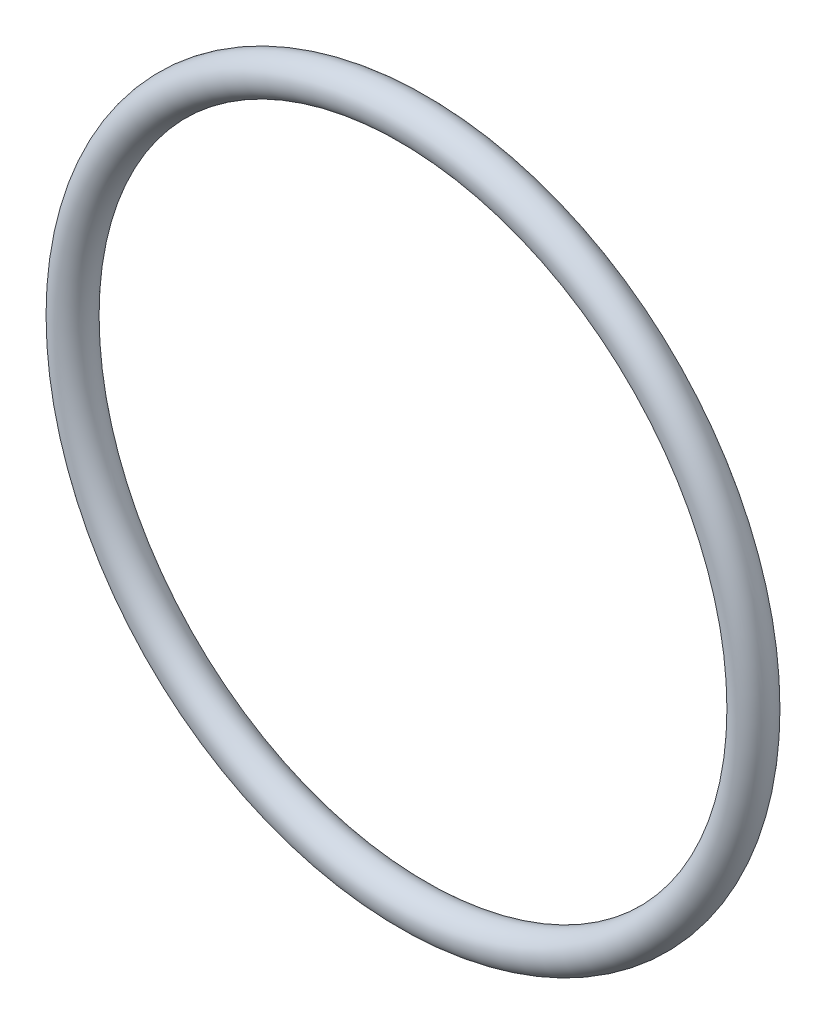
ISO-10303-21;
HEADER;
FILE_DESCRIPTION(('STEP AP214'),'2;1');
FILE_NAME('part.step','',(''),(''),'','','');
FILE_SCHEMA(('AUTOMOTIVE_DESIGN { 1 0 10303 214 1 1 1 1 }'));
ENDSEC;
DATA;
#1=APPLICATION_CONTEXT('core data for automotive mechanical design processes');
#2=APPLICATION_PROTOCOL_DEFINITION('international standard','automotive_design',2000,#1);
#3=PRODUCT_CONTEXT('',#1,'mechanical');
#4=PRODUCT('Part','Part','',(#3));
#5=PRODUCT_RELATED_PRODUCT_CATEGORY('part','',(#4));
#6=PRODUCT_DEFINITION_FORMATION('','',#4);
#7=PRODUCT_DEFINITION_CONTEXT('part definition',#1,'design');
#8=PRODUCT_DEFINITION('design','',#6,#7);
#9=PRODUCT_DEFINITION_SHAPE('','',#8);
#10=(LENGTH_UNIT() NAMED_UNIT(*) SI_UNIT(.MILLI.,.METRE.));
#11=(NAMED_UNIT(*) PLANE_ANGLE_UNIT() SI_UNIT($,.RADIAN.));
#12=(NAMED_UNIT(*) SI_UNIT($,.STERADIAN.) SOLID_ANGLE_UNIT());
#13=UNCERTAINTY_MEASURE_WITH_UNIT(LENGTH_MEASURE(1.E-05),#10,'distance_accuracy_value','');
#14=(GEOMETRIC_REPRESENTATION_CONTEXT(3) GLOBAL_UNCERTAINTY_ASSIGNED_CONTEXT((#13)) GLOBAL_UNIT_ASSIGNED_CONTEXT((#10,
#11,#12)) REPRESENTATION_CONTEXT('',''));
#15=CARTESIAN_POINT('',(0.,0.,0.));
#16=DIRECTION('',(0.,0.,1.));
#17=DIRECTION('',(1.,0.,0.));
#18=AXIS2_PLACEMENT_3D('',#15,#16,#17);
#19=CARTESIAN_POINT('',(0.,0.,0.));
#20=DIRECTION('',(0.,0.,1.));
#21=DIRECTION('',(1.,0.,0.));
#22=AXIS2_PLACEMENT_3D('',#19,#20,#21);
#23=TOROIDAL_SURFACE('',#22,48.387,2.667);
#24=CARTESIAN_POINT('',(51.054,0.,0.));
#25=VERTEX_POINT('',#24);
#26=VERTEX_LOOP('',#25);
#27=FACE_BOUND('',#26,.T.);
#28=ADVANCED_FACE('F43',(#27),#23,.T.);
#29=CLOSED_SHELL('',(#28));
#30=MANIFOLD_SOLID_BREP('B2',#29);
#31=ADVANCED_BREP_SHAPE_REPRESENTATION('',(#18,#30),#14);
#32=SHAPE_DEFINITION_REPRESENTATION(#9,#31);
ENDSEC;
END-ISO-10303-21;
